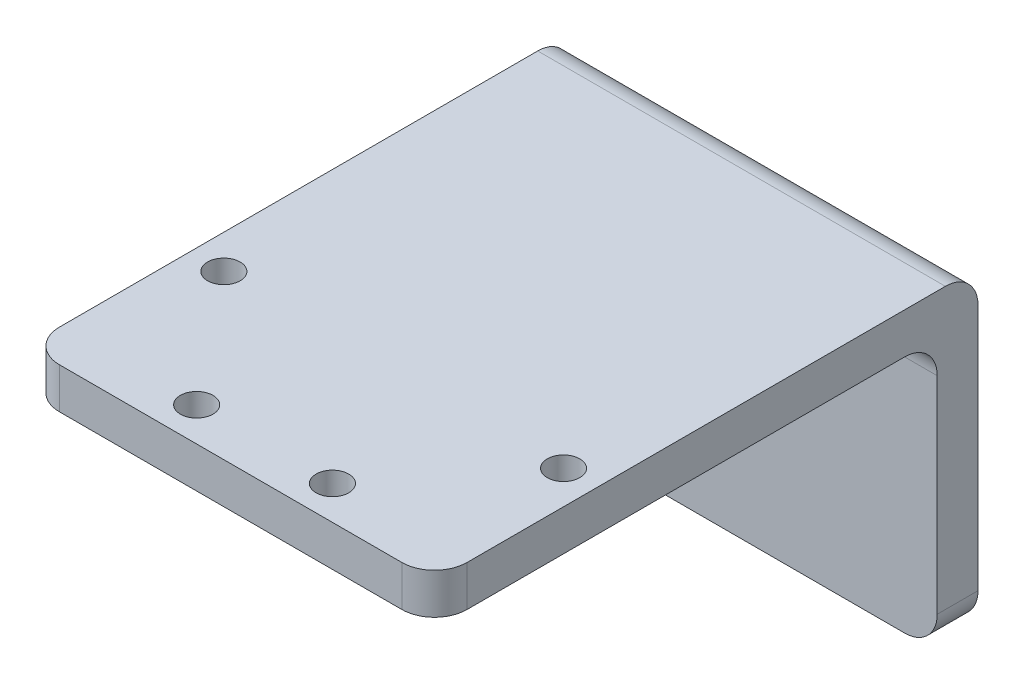
ISO-10303-21;
HEADER;
FILE_DESCRIPTION(('STEP AP214'),'2;1');
FILE_NAME('part.step','',(''),(''),'','','');
FILE_SCHEMA(('AUTOMOTIVE_DESIGN { 1 0 10303 214 1 1 1 1 }'));
ENDSEC;
DATA;
#1=APPLICATION_CONTEXT('core data for automotive mechanical design processes');
#2=APPLICATION_PROTOCOL_DEFINITION('international standard','automotive_design',2000,#1);
#3=PRODUCT_CONTEXT('',#1,'mechanical');
#4=PRODUCT('Part','Part','',(#3));
#5=PRODUCT_RELATED_PRODUCT_CATEGORY('part','',(#4));
#6=PRODUCT_DEFINITION_FORMATION('','',#4);
#7=PRODUCT_DEFINITION_CONTEXT('part definition',#1,'design');
#8=PRODUCT_DEFINITION('design','',#6,#7);
#9=PRODUCT_DEFINITION_SHAPE('','',#8);
#10=(LENGTH_UNIT() NAMED_UNIT(*) SI_UNIT(.MILLI.,.METRE.));
#11=(NAMED_UNIT(*) PLANE_ANGLE_UNIT() SI_UNIT($,.RADIAN.));
#12=(NAMED_UNIT(*) SI_UNIT($,.STERADIAN.) SOLID_ANGLE_UNIT());
#13=UNCERTAINTY_MEASURE_WITH_UNIT(LENGTH_MEASURE(1.E-05),#10,'distance_accuracy_value','');
#14=(GEOMETRIC_REPRESENTATION_CONTEXT(3) GLOBAL_UNCERTAINTY_ASSIGNED_CONTEXT((#13)) GLOBAL_UNIT_ASSIGNED_CONTEXT((#10,
#11,#12)) REPRESENTATION_CONTEXT('',''));
#15=CARTESIAN_POINT('',(0.,0.,0.));
#16=DIRECTION('',(0.,0.,1.));
#17=DIRECTION('',(1.,0.,0.));
#18=AXIS2_PLACEMENT_3D('',#15,#16,#17);
#19=CARTESIAN_POINT('',(0.,0.,0.));
#20=DIRECTION('',(0.,-1.,0.));
#21=DIRECTION('',(0.,0.,-1.));
#22=AXIS2_PLACEMENT_3D('',#19,#20,#21);
#23=PLANE('',#22);
#24=CARTESIAN_POINT('',(-12.5,0.,8.));
#25=DIRECTION('',(0.,-1.,0.));
#26=DIRECTION('',(0.,0.,-1.));
#27=AXIS2_PLACEMENT_3D('',#24,#25,#26);
#28=CIRCLE('',#27,1.2);
#29=CARTESIAN_POINT('',(-12.5,0.,6.8));
#30=VERTEX_POINT('',#29);
#31=EDGE_CURVE('E217',#30,#30,#28,.T.);
#32=ORIENTED_EDGE('',*,*,#31,.F.);
#33=EDGE_LOOP('',(#32));
#34=FACE_BOUND('',#33,.T.);
#35=CARTESIAN_POINT('',(5.00938560604868,0.,17.518859969709));
#36=DIRECTION('',(0.,-1.,0.));
#37=DIRECTION('',(0.,0.,1.));
#38=AXIS2_PLACEMENT_3D('',#35,#36,#37);
#39=CIRCLE('',#38,1.2);
#40=CARTESIAN_POINT('',(5.00938560604868,0.,18.718859969709));
#41=VERTEX_POINT('',#40);
#42=EDGE_CURVE('E231',#41,#41,#39,.T.);
#43=ORIENTED_EDGE('',*,*,#42,.F.);
#44=EDGE_LOOP('',(#43));
#45=FACE_BOUND('',#44,.T.);
#46=CARTESIAN_POINT('',(12.5451325660364,0.,8.04719075277392));
#47=DIRECTION('',(0.,-1.,0.));
#48=DIRECTION('',(0.,0.,1.));
#49=AXIS2_PLACEMENT_3D('',#46,#47,#48);
#50=CIRCLE('',#49,1.2);
#51=CARTESIAN_POINT('',(12.5451325660364,0.,9.24719075277392));
#52=VERTEX_POINT('',#51);
#53=EDGE_CURVE('E225',#52,#52,#50,.T.);
#54=ORIENTED_EDGE('',*,*,#53,.F.);
#55=EDGE_LOOP('',(#54));
#56=FACE_BOUND('',#55,.T.);
#57=CARTESIAN_POINT('',(-5.,0.,17.5));
#58=DIRECTION('',(0.,-1.,0.));
#59=DIRECTION('',(0.,0.,-1.));
#60=AXIS2_PLACEMENT_3D('',#57,#58,#59);
#61=CIRCLE('',#60,1.2);
#62=CARTESIAN_POINT('',(-5.,0.,16.3));
#63=VERTEX_POINT('',#62);
#64=EDGE_CURVE('E224',#63,#63,#61,.T.);
#65=ORIENTED_EDGE('',*,*,#64,.F.);
#66=EDGE_LOOP('',(#65));
#67=FACE_BOUND('',#66,.T.);
#68=DIRECTION('',(0.,0.,-1.));
#69=VECTOR('',#68,1.);
#70=CARTESIAN_POINT('',(15.,0.,20.));
#71=LINE('',#70,#69);
#72=CARTESIAN_POINT('',(15.,0.,17.6));
#73=VERTEX_POINT('',#72);
#74=CARTESIAN_POINT('',(15.,0.,-14.6));
#75=VERTEX_POINT('',#74);
#76=EDGE_CURVE('E147',#73,#75,#71,.T.);
#77=ORIENTED_EDGE('',*,*,#76,.F.);
#78=CARTESIAN_POINT('',(12.6,0.,17.6));
#79=DIRECTION('',(0.,-1.,0.));
#80=DIRECTION('',(0.,0.,-1.));
#81=AXIS2_PLACEMENT_3D('',#78,#79,#80);
#82=CIRCLE('',#81,2.4);
#83=CARTESIAN_POINT('',(12.6,0.,20.));
#84=VERTEX_POINT('',#83);
#85=EDGE_CURVE('E174',#73,#84,#82,.T.);
#86=ORIENTED_EDGE('',*,*,#85,.T.);
#87=DIRECTION('',(1.,0.,0.));
#88=VECTOR('',#87,1.);
#89=CARTESIAN_POINT('',(-15.,0.,20.));
#90=LINE('',#89,#88);
#91=CARTESIAN_POINT('',(-12.6,0.,20.));
#92=VERTEX_POINT('',#91);
#93=EDGE_CURVE('E146',#92,#84,#90,.T.);
#94=ORIENTED_EDGE('',*,*,#93,.F.);
#95=CARTESIAN_POINT('',(-12.6,0.,17.6));
#96=DIRECTION('',(0.,-1.,0.));
#97=DIRECTION('',(0.,0.,-1.));
#98=AXIS2_PLACEMENT_3D('',#95,#96,#97);
#99=CIRCLE('',#98,2.4);
#100=CARTESIAN_POINT('',(-15.,0.,17.6));
#101=VERTEX_POINT('',#100);
#102=EDGE_CURVE('E145',#92,#101,#99,.T.);
#103=ORIENTED_EDGE('',*,*,#102,.T.);
#104=DIRECTION('',(0.,0.,1.));
#105=VECTOR('',#104,1.);
#106=CARTESIAN_POINT('',(-15.,0.,-20.));
#107=LINE('',#106,#105);
#108=CARTESIAN_POINT('',(-15.,0.,-14.6));
#109=VERTEX_POINT('',#108);
#110=EDGE_CURVE('E129',#109,#101,#107,.T.);
#111=ORIENTED_EDGE('',*,*,#110,.F.);
#112=DIRECTION('',(1.,0.,0.));
#113=VECTOR('',#112,1.);
#114=CARTESIAN_POINT('',(15.,0.,-14.6));
#115=LINE('',#114,#113);
#116=EDGE_CURVE('E143',#109,#75,#115,.T.);
#117=ORIENTED_EDGE('',*,*,#116,.T.);
#118=EDGE_LOOP('',(#77,#86,#94,#103,#111,#117));
#119=FACE_BOUND('',#118,.T.);
#120=ADVANCED_FACE('F35',(#34,#45,#56,#67,#119),#23,.T.);
#121=CARTESIAN_POINT('',(15.,3.,20.));
#122=DIRECTION('',(-1.,0.,0.));
#123=DIRECTION('',(0.,0.,1.));
#124=AXIS2_PLACEMENT_3D('',#121,#122,#123);
#125=PLANE('',#124);
#126=DIRECTION('',(0.,1.,0.));
#127=VECTOR('',#126,1.);
#128=CARTESIAN_POINT('',(15.,-20.,-17.));
#129=LINE('',#128,#127);
#130=CARTESIAN_POINT('',(15.,-17.6,-17.));
#131=VERTEX_POINT('',#130);
#132=CARTESIAN_POINT('',(15.,-2.4,-17.));
#133=VERTEX_POINT('',#132);
#134=EDGE_CURVE('E209',#131,#133,#129,.T.);
#135=ORIENTED_EDGE('',*,*,#134,.F.);
#136=DIRECTION('',(0.,0.,1.));
#137=VECTOR('',#136,1.);
#138=CARTESIAN_POINT('',(15.,-17.6,-20.));
#139=LINE('',#138,#137);
#140=CARTESIAN_POINT('',(15.,-17.6,-20.));
#141=VERTEX_POINT('',#140);
#142=EDGE_CURVE('E58',#131,#141,#139,.F.);
#143=ORIENTED_EDGE('',*,*,#142,.T.);
#144=DIRECTION('',(0.,-1.,0.));
#145=VECTOR('',#144,1.);
#146=CARTESIAN_POINT('',(15.,3.,-20.));
#147=LINE('',#146,#145);
#148=CARTESIAN_POINT('',(15.,0.6,-20.));
#149=VERTEX_POINT('',#148);
#150=EDGE_CURVE('E153',#149,#141,#147,.T.);
#151=ORIENTED_EDGE('',*,*,#150,.F.);
#152=CARTESIAN_POINT('',(15.,0.6,-17.6));
#153=DIRECTION('',(-1.,0.,0.));
#154=DIRECTION('',(0.,0.,1.));
#155=AXIS2_PLACEMENT_3D('',#152,#153,#154);
#156=CIRCLE('',#155,2.4);
#157=CARTESIAN_POINT('',(15.,3.,-17.6));
#158=VERTEX_POINT('',#157);
#159=EDGE_CURVE('E167',#149,#158,#156,.F.);
#160=ORIENTED_EDGE('',*,*,#159,.T.);
#161=DIRECTION('',(0.,0.,-1.));
#162=VECTOR('',#161,1.);
#163=CARTESIAN_POINT('',(15.,3.,20.));
#164=LINE('',#163,#162);
#165=CARTESIAN_POINT('',(15.,3.,17.6));
#166=VERTEX_POINT('',#165);
#167=EDGE_CURVE('E244',#166,#158,#164,.T.);
#168=ORIENTED_EDGE('',*,*,#167,.F.);
#169=DIRECTION('',(0.,-1.,0.));
#170=VECTOR('',#169,1.);
#171=CARTESIAN_POINT('',(15.,3.,17.6));
#172=LINE('',#171,#170);
#173=EDGE_CURVE('E170',#166,#73,#172,.T.);
#174=ORIENTED_EDGE('',*,*,#173,.T.);
#175=ORIENTED_EDGE('',*,*,#76,.T.);
#176=CARTESIAN_POINT('',(15.,-2.4,-14.6));
#177=DIRECTION('',(-1.,0.,0.));
#178=DIRECTION('',(0.,0.,1.));
#179=AXIS2_PLACEMENT_3D('',#176,#177,#178);
#180=CIRCLE('',#179,2.4);
#181=EDGE_CURVE('E138',#75,#133,#180,.T.);
#182=ORIENTED_EDGE('',*,*,#181,.T.);
#183=EDGE_LOOP('',(#135,#143,#151,#160,#168,#174,#175,#182));
#184=FACE_BOUND('',#183,.T.);
#185=ADVANCED_FACE('F215',(#184),#125,.F.);
#186=CARTESIAN_POINT('',(-15.,3.,-20.));
#187=DIRECTION('',(0.,0.,1.));
#188=DIRECTION('',(1.,0.,0.));
#189=AXIS2_PLACEMENT_3D('',#186,#187,#188);
#190=PLANE('',#189);
#191=ORIENTED_EDGE('',*,*,#150,.T.);
#192=CARTESIAN_POINT('',(12.6,-17.6,-20.));
#193=DIRECTION('',(0.,0.,1.));
#194=DIRECTION('',(1.,0.,0.));
#195=AXIS2_PLACEMENT_3D('',#192,#193,#194);
#196=CIRCLE('',#195,2.4);
#197=CARTESIAN_POINT('',(12.6,-20.,-20.));
#198=VERTEX_POINT('',#197);
#199=EDGE_CURVE('E43',#141,#198,#196,.F.);
#200=ORIENTED_EDGE('',*,*,#199,.T.);
#201=DIRECTION('',(1.,0.,0.));
#202=VECTOR('',#201,1.);
#203=CARTESIAN_POINT('',(0.,-20.,-20.));
#204=LINE('',#203,#202);
#205=CARTESIAN_POINT('',(-12.6,-20.,-20.));
#206=VERTEX_POINT('',#205);
#207=EDGE_CURVE('E201',#206,#198,#204,.T.);
#208=ORIENTED_EDGE('',*,*,#207,.F.);
#209=CARTESIAN_POINT('',(-12.6,-17.6,-20.));
#210=DIRECTION('',(0.,0.,1.));
#211=DIRECTION('',(1.,0.,0.));
#212=AXIS2_PLACEMENT_3D('',#209,#210,#211);
#213=CIRCLE('',#212,2.4);
#214=CARTESIAN_POINT('',(-15.,-17.6,-20.));
#215=VERTEX_POINT('',#214);
#216=EDGE_CURVE('E50',#206,#215,#213,.F.);
#217=ORIENTED_EDGE('',*,*,#216,.T.);
#218=DIRECTION('',(0.,-1.,0.));
#219=VECTOR('',#218,1.);
#220=CARTESIAN_POINT('',(-15.,3.,-20.));
#221=LINE('',#220,#219);
#222=CARTESIAN_POINT('',(-15.,0.6,-20.));
#223=VERTEX_POINT('',#222);
#224=EDGE_CURVE('E156',#223,#215,#221,.T.);
#225=ORIENTED_EDGE('',*,*,#224,.F.);
#226=DIRECTION('',(-1.,0.,0.));
#227=VECTOR('',#226,1.);
#228=CARTESIAN_POINT('',(-15.,0.6,-20.));
#229=LINE('',#228,#227);
#230=EDGE_CURVE('E165',#223,#149,#229,.F.);
#231=ORIENTED_EDGE('',*,*,#230,.T.);
#232=EDGE_LOOP('',(#191,#200,#208,#217,#225,#231));
#233=FACE_BOUND('',#232,.T.);
#234=ADVANCED_FACE('F200',(#233),#190,.F.);
#235=CARTESIAN_POINT('',(-15.,3.,-20.));
#236=DIRECTION('',(1.,0.,0.));
#237=DIRECTION('',(0.,0.,-1.));
#238=AXIS2_PLACEMENT_3D('',#235,#236,#237);
#239=PLANE('',#238);
#240=ORIENTED_EDGE('',*,*,#224,.T.);
#241=DIRECTION('',(0.,0.,-1.));
#242=VECTOR('',#241,1.);
#243=CARTESIAN_POINT('',(-15.,-17.6,-17.));
#244=LINE('',#243,#242);
#245=CARTESIAN_POINT('',(-15.,-17.6,-17.));
#246=VERTEX_POINT('',#245);
#247=EDGE_CURVE('E11',#215,#246,#244,.F.);
#248=ORIENTED_EDGE('',*,*,#247,.T.);
#249=DIRECTION('',(0.,1.,0.));
#250=VECTOR('',#249,1.);
#251=CARTESIAN_POINT('',(-15.,-20.,-17.));
#252=LINE('',#251,#250);
#253=CARTESIAN_POINT('',(-15.,-2.4,-17.));
#254=VERTEX_POINT('',#253);
#255=EDGE_CURVE('E132',#246,#254,#252,.T.);
#256=ORIENTED_EDGE('',*,*,#255,.T.);
#257=CARTESIAN_POINT('',(-15.,-2.4,-14.6));
#258=DIRECTION('',(1.,0.,0.));
#259=DIRECTION('',(0.,0.,-1.));
#260=AXIS2_PLACEMENT_3D('',#257,#258,#259);
#261=CIRCLE('',#260,2.4);
#262=EDGE_CURVE('E126',#254,#109,#261,.T.);
#263=ORIENTED_EDGE('',*,*,#262,.T.);
#264=ORIENTED_EDGE('',*,*,#110,.T.);
#265=DIRECTION('',(0.,-1.,0.));
#266=VECTOR('',#265,1.);
#267=CARTESIAN_POINT('',(-15.,3.,17.6));
#268=LINE('',#267,#266);
#269=CARTESIAN_POINT('',(-15.,3.,17.6));
#270=VERTEX_POINT('',#269);
#271=EDGE_CURVE('E185',#101,#270,#268,.F.);
#272=ORIENTED_EDGE('',*,*,#271,.T.);
#273=DIRECTION('',(0.,0.,1.));
#274=VECTOR('',#273,1.);
#275=CARTESIAN_POINT('',(-15.,3.,-20.));
#276=LINE('',#275,#274);
#277=CARTESIAN_POINT('',(-15.,3.,-17.6));
#278=VERTEX_POINT('',#277);
#279=EDGE_CURVE('E246',#278,#270,#276,.T.);
#280=ORIENTED_EDGE('',*,*,#279,.F.);
#281=CARTESIAN_POINT('',(-15.,0.6,-17.6));
#282=DIRECTION('',(1.,0.,0.));
#283=DIRECTION('',(0.,0.,-1.));
#284=AXIS2_PLACEMENT_3D('',#281,#282,#283);
#285=CIRCLE('',#284,2.4);
#286=EDGE_CURVE('E163',#278,#223,#285,.F.);
#287=ORIENTED_EDGE('',*,*,#286,.T.);
#288=EDGE_LOOP('',(#240,#248,#256,#263,#264,#272,#280,#287));
#289=FACE_BOUND('',#288,.T.);
#290=ADVANCED_FACE('F128',(#289),#239,.F.);
#291=CARTESIAN_POINT('',(-15.,3.,20.));
#292=DIRECTION('',(0.,0.,-1.));
#293=DIRECTION('',(-1.,0.,0.));
#294=AXIS2_PLACEMENT_3D('',#291,#292,#293);
#295=PLANE('',#294);
#296=ORIENTED_EDGE('',*,*,#93,.T.);
#297=DIRECTION('',(0.,-1.,0.));
#298=VECTOR('',#297,1.);
#299=CARTESIAN_POINT('',(12.6,3.,20.));
#300=LINE('',#299,#298);
#301=CARTESIAN_POINT('',(12.6,3.,20.));
#302=VERTEX_POINT('',#301);
#303=EDGE_CURVE('E179',#84,#302,#300,.F.);
#304=ORIENTED_EDGE('',*,*,#303,.T.);
#305=DIRECTION('',(1.,0.,0.));
#306=VECTOR('',#305,1.);
#307=CARTESIAN_POINT('',(-15.,3.,20.));
#308=LINE('',#307,#306);
#309=CARTESIAN_POINT('',(-12.6,3.,20.));
#310=VERTEX_POINT('',#309);
#311=EDGE_CURVE('E249',#310,#302,#308,.T.);
#312=ORIENTED_EDGE('',*,*,#311,.F.);
#313=DIRECTION('',(0.,-1.,0.));
#314=VECTOR('',#313,1.);
#315=CARTESIAN_POINT('',(-12.6,3.,20.));
#316=LINE('',#315,#314);
#317=EDGE_CURVE('E176',#310,#92,#316,.T.);
#318=ORIENTED_EDGE('',*,*,#317,.T.);
#319=EDGE_LOOP('',(#296,#304,#312,#318));
#320=FACE_BOUND('',#319,.T.);
#321=ADVANCED_FACE('F277',(#320),#295,.F.);
#322=CARTESIAN_POINT('',(0.,3.,0.));
#323=DIRECTION('',(0.,-1.,0.));
#324=DIRECTION('',(0.,0.,-1.));
#325=AXIS2_PLACEMENT_3D('',#322,#323,#324);
#326=PLANE('',#325);
#327=CARTESIAN_POINT('',(-12.5,3.,8.));
#328=DIRECTION('',(0.,-1.,0.));
#329=DIRECTION('',(0.,0.,-1.));
#330=AXIS2_PLACEMENT_3D('',#327,#328,#329);
#331=CIRCLE('',#330,1.2);
#332=CARTESIAN_POINT('',(-12.5,3.,6.8));
#333=VERTEX_POINT('',#332);
#334=EDGE_CURVE('E234',#333,#333,#331,.T.);
#335=ORIENTED_EDGE('',*,*,#334,.T.);
#336=EDGE_LOOP('',(#335));
#337=FACE_BOUND('',#336,.T.);
#338=CARTESIAN_POINT('',(5.00938560604868,3.,17.518859969709));
#339=DIRECTION('',(0.,-1.,0.));
#340=DIRECTION('',(0.,0.,1.));
#341=AXIS2_PLACEMENT_3D('',#338,#339,#340);
#342=CIRCLE('',#341,1.2);
#343=CARTESIAN_POINT('',(5.00938560604868,3.,18.718859969709));
#344=VERTEX_POINT('',#343);
#345=EDGE_CURVE('E228',#344,#344,#342,.T.);
#346=ORIENTED_EDGE('',*,*,#345,.T.);
#347=EDGE_LOOP('',(#346));
#348=FACE_BOUND('',#347,.T.);
#349=CARTESIAN_POINT('',(12.5451325660364,3.,8.04719075277392));
#350=DIRECTION('',(0.,-1.,0.));
#351=DIRECTION('',(0.,0.,1.));
#352=AXIS2_PLACEMENT_3D('',#349,#350,#351);
#353=CIRCLE('',#352,1.2);
#354=CARTESIAN_POINT('',(12.5451325660364,3.,9.24719075277392));
#355=VERTEX_POINT('',#354);
#356=EDGE_CURVE('E221',#355,#355,#353,.T.);
#357=ORIENTED_EDGE('',*,*,#356,.T.);
#358=EDGE_LOOP('',(#357));
#359=FACE_BOUND('',#358,.T.);
#360=CARTESIAN_POINT('',(-5.,3.,17.5));
#361=DIRECTION('',(0.,-1.,0.));
#362=DIRECTION('',(0.,0.,-1.));
#363=AXIS2_PLACEMENT_3D('',#360,#361,#362);
#364=CIRCLE('',#363,1.2);
#365=CARTESIAN_POINT('',(-5.,3.,16.3));
#366=VERTEX_POINT('',#365);
#367=EDGE_CURVE('E239',#366,#366,#364,.T.);
#368=ORIENTED_EDGE('',*,*,#367,.T.);
#369=EDGE_LOOP('',(#368));
#370=FACE_BOUND('',#369,.T.);
#371=ORIENTED_EDGE('',*,*,#311,.T.);
#372=CARTESIAN_POINT('',(12.6,3.,17.6));
#373=DIRECTION('',(0.,-1.,0.));
#374=DIRECTION('',(0.,0.,-1.));
#375=AXIS2_PLACEMENT_3D('',#372,#373,#374);
#376=CIRCLE('',#375,2.4);
#377=EDGE_CURVE('E183',#302,#166,#376,.F.);
#378=ORIENTED_EDGE('',*,*,#377,.T.);
#379=ORIENTED_EDGE('',*,*,#167,.T.);
#380=DIRECTION('',(-1.,0.,0.));
#381=VECTOR('',#380,1.);
#382=CARTESIAN_POINT('',(0.,3.,-17.6));
#383=LINE('',#382,#381);
#384=EDGE_CURVE('E137',#158,#278,#383,.T.);
#385=ORIENTED_EDGE('',*,*,#384,.T.);
#386=ORIENTED_EDGE('',*,*,#279,.T.);
#387=CARTESIAN_POINT('',(-12.6,3.,17.6));
#388=DIRECTION('',(0.,-1.,0.));
#389=DIRECTION('',(0.,0.,-1.));
#390=AXIS2_PLACEMENT_3D('',#387,#388,#389);
#391=CIRCLE('',#390,2.4);
#392=EDGE_CURVE('E181',#270,#310,#391,.F.);
#393=ORIENTED_EDGE('',*,*,#392,.T.);
#394=EDGE_LOOP('',(#371,#378,#379,#385,#386,#393));
#395=FACE_BOUND('',#394,.T.);
#396=ADVANCED_FACE('F275',(#337,#348,#359,#370,#395),#326,.F.);
#397=CARTESIAN_POINT('',(-5.,3.,17.5));
#398=DIRECTION('',(0.,-1.,0.));
#399=DIRECTION('',(0.,0.,-1.));
#400=AXIS2_PLACEMENT_3D('',#397,#398,#399);
#401=CYLINDRICAL_SURFACE('',#400,1.2);
#402=ORIENTED_EDGE('',*,*,#367,.F.);
#403=EDGE_LOOP('',(#402));
#404=FACE_BOUND('',#403,.T.);
#405=ORIENTED_EDGE('',*,*,#64,.T.);
#406=EDGE_LOOP('',(#405));
#407=FACE_BOUND('',#406,.T.);
#408=ADVANCED_FACE('F310',(#404,#407),#401,.F.);
#409=CARTESIAN_POINT('',(12.5451325660364,3.,8.04719075277392));
#410=DIRECTION('',(0.,-1.,0.));
#411=DIRECTION('',(0.,0.,-1.));
#412=AXIS2_PLACEMENT_3D('',#409,#410,#411);
#413=CYLINDRICAL_SURFACE('',#412,1.2);
#414=ORIENTED_EDGE('',*,*,#356,.F.);
#415=EDGE_LOOP('',(#414));
#416=FACE_BOUND('',#415,.T.);
#417=ORIENTED_EDGE('',*,*,#53,.T.);
#418=EDGE_LOOP('',(#417));
#419=FACE_BOUND('',#418,.T.);
#420=ADVANCED_FACE('F315',(#416,#419),#413,.F.);
#421=CARTESIAN_POINT('',(5.00938560604868,3.,17.518859969709));
#422=DIRECTION('',(0.,-1.,0.));
#423=DIRECTION('',(0.,0.,-1.));
#424=AXIS2_PLACEMENT_3D('',#421,#422,#423);
#425=CYLINDRICAL_SURFACE('',#424,1.2);
#426=ORIENTED_EDGE('',*,*,#345,.F.);
#427=EDGE_LOOP('',(#426));
#428=FACE_BOUND('',#427,.T.);
#429=ORIENTED_EDGE('',*,*,#42,.T.);
#430=EDGE_LOOP('',(#429));
#431=FACE_BOUND('',#430,.T.);
#432=ADVANCED_FACE('F330',(#428,#431),#425,.F.);
#433=CARTESIAN_POINT('',(-12.5,3.,8.));
#434=DIRECTION('',(0.,-1.,0.));
#435=DIRECTION('',(0.,0.,-1.));
#436=AXIS2_PLACEMENT_3D('',#433,#434,#435);
#437=CYLINDRICAL_SURFACE('',#436,1.2);
#438=ORIENTED_EDGE('',*,*,#334,.F.);
#439=EDGE_LOOP('',(#438));
#440=FACE_BOUND('',#439,.T.);
#441=ORIENTED_EDGE('',*,*,#31,.T.);
#442=EDGE_LOOP('',(#441));
#443=FACE_BOUND('',#442,.T.);
#444=ADVANCED_FACE('F337',(#440,#443),#437,.F.);
#445=CARTESIAN_POINT('',(0.,-20.,-17.));
#446=DIRECTION('',(0.,0.,1.));
#447=DIRECTION('',(1.,0.,0.));
#448=AXIS2_PLACEMENT_3D('',#445,#446,#447);
#449=PLANE('',#448);
#450=DIRECTION('',(1.,0.,0.));
#451=VECTOR('',#450,1.);
#452=CARTESIAN_POINT('',(0.,-20.,-17.));
#453=LINE('',#452,#451);
#454=CARTESIAN_POINT('',(-12.6,-20.,-17.));
#455=VERTEX_POINT('',#454);
#456=CARTESIAN_POINT('',(12.6,-20.,-17.));
#457=VERTEX_POINT('',#456);
#458=EDGE_CURVE('E210',#455,#457,#453,.T.);
#459=ORIENTED_EDGE('',*,*,#458,.T.);
#460=CARTESIAN_POINT('',(12.6,-17.6,-17.));
#461=DIRECTION('',(0.,0.,1.));
#462=DIRECTION('',(1.,0.,0.));
#463=AXIS2_PLACEMENT_3D('',#460,#461,#462);
#464=CIRCLE('',#463,2.4);
#465=EDGE_CURVE('E195',#457,#131,#464,.T.);
#466=ORIENTED_EDGE('',*,*,#465,.T.);
#467=ORIENTED_EDGE('',*,*,#134,.T.);
#468=DIRECTION('',(1.,0.,0.));
#469=VECTOR('',#468,1.);
#470=CARTESIAN_POINT('',(-15.,-2.4,-17.));
#471=LINE('',#470,#469);
#472=EDGE_CURVE('E152',#133,#254,#471,.F.);
#473=ORIENTED_EDGE('',*,*,#472,.T.);
#474=ORIENTED_EDGE('',*,*,#255,.F.);
#475=CARTESIAN_POINT('',(-12.6,-17.6,-17.));
#476=DIRECTION('',(0.,0.,1.));
#477=DIRECTION('',(1.,0.,0.));
#478=AXIS2_PLACEMENT_3D('',#475,#476,#477);
#479=CIRCLE('',#478,2.4);
#480=EDGE_CURVE('E193',#246,#455,#479,.T.);
#481=ORIENTED_EDGE('',*,*,#480,.T.);
#482=EDGE_LOOP('',(#459,#466,#467,#473,#474,#481));
#483=FACE_BOUND('',#482,.T.);
#484=ADVANCED_FACE('F214',(#483),#449,.T.);
#485=CARTESIAN_POINT('',(0.,-20.,0.));
#486=DIRECTION('',(0.,-1.,0.));
#487=DIRECTION('',(0.,0.,-1.));
#488=AXIS2_PLACEMENT_3D('',#485,#486,#487);
#489=PLANE('',#488);
#490=ORIENTED_EDGE('',*,*,#207,.T.);
#491=DIRECTION('',(0.,0.,1.));
#492=VECTOR('',#491,1.);
#493=CARTESIAN_POINT('',(12.6,-20.,-17.));
#494=LINE('',#493,#492);
#495=EDGE_CURVE('E190',#198,#457,#494,.T.);
#496=ORIENTED_EDGE('',*,*,#495,.T.);
#497=ORIENTED_EDGE('',*,*,#458,.F.);
#498=DIRECTION('',(0.,0.,-1.));
#499=VECTOR('',#498,1.);
#500=CARTESIAN_POINT('',(-12.6,-20.,-20.));
#501=LINE('',#500,#499);
#502=EDGE_CURVE('E187',#455,#206,#501,.T.);
#503=ORIENTED_EDGE('',*,*,#502,.T.);
#504=EDGE_LOOP('',(#490,#496,#497,#503));
#505=FACE_BOUND('',#504,.T.);
#506=ADVANCED_FACE('F205',(#505),#489,.T.);
#507=CARTESIAN_POINT('',(0.,-2.4,-14.6));
#508=DIRECTION('',(-1.,0.,0.));
#509=DIRECTION('',(0.,0.,1.));
#510=AXIS2_PLACEMENT_3D('',#507,#508,#509);
#511=CYLINDRICAL_SURFACE('',#510,2.4);
#512=ORIENTED_EDGE('',*,*,#262,.F.);
#513=ORIENTED_EDGE('',*,*,#472,.F.);
#514=ORIENTED_EDGE('',*,*,#181,.F.);
#515=ORIENTED_EDGE('',*,*,#116,.F.);
#516=EDGE_LOOP('',(#512,#513,#514,#515));
#517=FACE_BOUND('',#516,.T.);
#518=ADVANCED_FACE('F150',(#517),#511,.F.);
#519=CARTESIAN_POINT('',(0.,0.6,-17.6));
#520=DIRECTION('',(-1.,0.,0.));
#521=DIRECTION('',(0.,0.,1.));
#522=AXIS2_PLACEMENT_3D('',#519,#520,#521);
#523=CYLINDRICAL_SURFACE('',#522,2.4);
#524=ORIENTED_EDGE('',*,*,#159,.F.);
#525=ORIENTED_EDGE('',*,*,#230,.F.);
#526=ORIENTED_EDGE('',*,*,#286,.F.);
#527=ORIENTED_EDGE('',*,*,#384,.F.);
#528=EDGE_LOOP('',(#524,#525,#526,#527));
#529=FACE_BOUND('',#528,.T.);
#530=ADVANCED_FACE('F287',(#529),#523,.T.);
#531=CARTESIAN_POINT('',(12.6,3.,17.6));
#532=DIRECTION('',(0.,-1.,0.));
#533=DIRECTION('',(0.,0.,-1.));
#534=AXIS2_PLACEMENT_3D('',#531,#532,#533);
#535=CYLINDRICAL_SURFACE('',#534,2.4);
#536=ORIENTED_EDGE('',*,*,#377,.F.);
#537=ORIENTED_EDGE('',*,*,#303,.F.);
#538=ORIENTED_EDGE('',*,*,#85,.F.);
#539=ORIENTED_EDGE('',*,*,#173,.F.);
#540=EDGE_LOOP('',(#536,#537,#538,#539));
#541=FACE_BOUND('',#540,.T.);
#542=ADVANCED_FACE('F290',(#541),#535,.T.);
#543=CARTESIAN_POINT('',(-12.6,3.,17.6));
#544=DIRECTION('',(0.,-1.,0.));
#545=DIRECTION('',(0.,0.,-1.));
#546=AXIS2_PLACEMENT_3D('',#543,#544,#545);
#547=CYLINDRICAL_SURFACE('',#546,2.4);
#548=ORIENTED_EDGE('',*,*,#392,.F.);
#549=ORIENTED_EDGE('',*,*,#271,.F.);
#550=ORIENTED_EDGE('',*,*,#102,.F.);
#551=ORIENTED_EDGE('',*,*,#317,.F.);
#552=EDGE_LOOP('',(#548,#549,#550,#551));
#553=FACE_BOUND('',#552,.T.);
#554=ADVANCED_FACE('F263',(#553),#547,.T.);
#555=CARTESIAN_POINT('',(12.6,-17.6,0.));
#556=DIRECTION('',(0.,0.,-1.));
#557=DIRECTION('',(-1.,0.,0.));
#558=AXIS2_PLACEMENT_3D('',#555,#556,#557);
#559=CYLINDRICAL_SURFACE('',#558,2.4);
#560=ORIENTED_EDGE('',*,*,#199,.F.);
#561=ORIENTED_EDGE('',*,*,#142,.F.);
#562=ORIENTED_EDGE('',*,*,#465,.F.);
#563=ORIENTED_EDGE('',*,*,#495,.F.);
#564=EDGE_LOOP('',(#560,#561,#562,#563));
#565=FACE_BOUND('',#564,.T.);
#566=ADVANCED_FACE('F212',(#565),#559,.T.);
#567=CARTESIAN_POINT('',(-12.6,-17.6,0.));
#568=DIRECTION('',(0.,0.,1.));
#569=DIRECTION('',(1.,0.,0.));
#570=AXIS2_PLACEMENT_3D('',#567,#568,#569);
#571=CYLINDRICAL_SURFACE('',#570,2.4);
#572=ORIENTED_EDGE('',*,*,#480,.F.);
#573=ORIENTED_EDGE('',*,*,#247,.F.);
#574=ORIENTED_EDGE('',*,*,#216,.F.);
#575=ORIENTED_EDGE('',*,*,#502,.F.);
#576=EDGE_LOOP('',(#572,#573,#574,#575));
#577=FACE_BOUND('',#576,.T.);
#578=ADVANCED_FACE('F37',(#577),#571,.T.);
#579=CLOSED_SHELL('',(#120,#185,#234,#290,#321,#396,#408,#420,#432,#444,#484,#506,#518,#530,
#542,#554,#566,#578));
#580=MANIFOLD_SOLID_BREP('B2',#579);
#581=ADVANCED_BREP_SHAPE_REPRESENTATION('',(#18,#580),#14);
#582=SHAPE_DEFINITION_REPRESENTATION(#9,#581);
ENDSEC;
END-ISO-10303-21;
